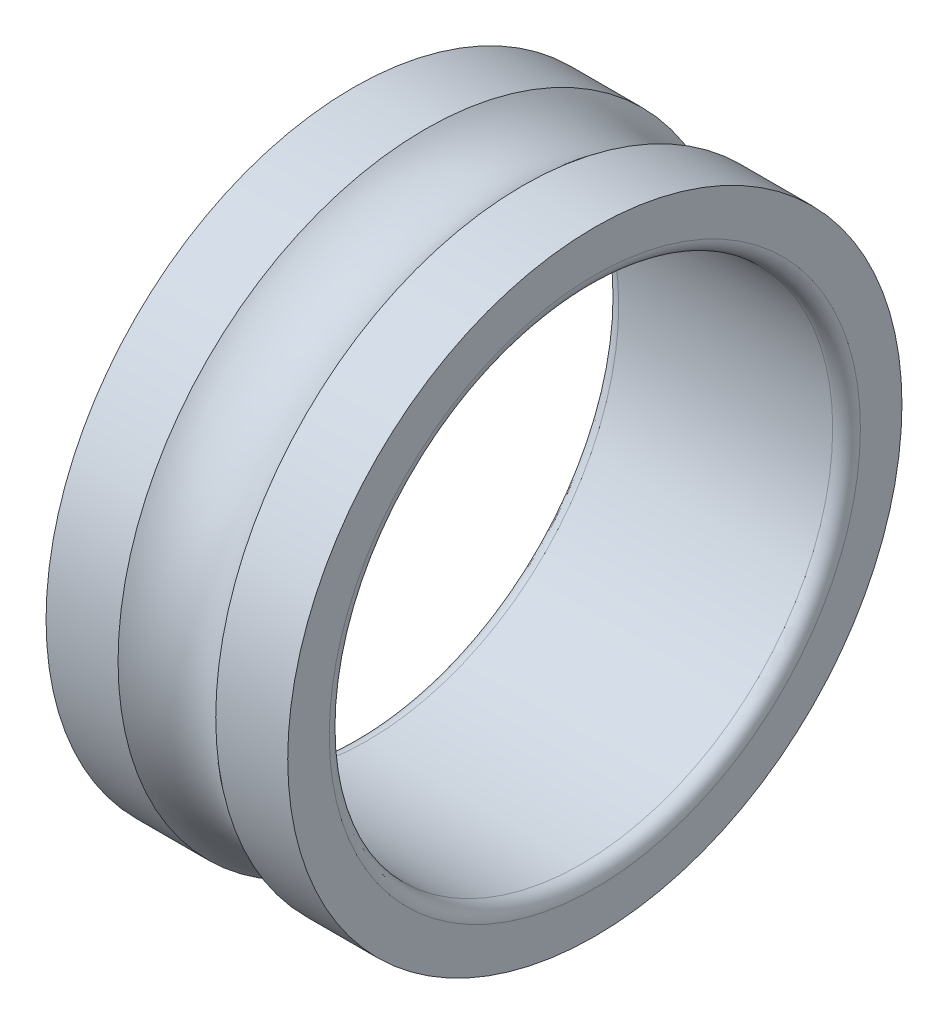
ISO-10303-21;
HEADER;
FILE_DESCRIPTION(('STEP AP214'),'2;1');
FILE_NAME('part.step','',(''),(''),'','','');
FILE_SCHEMA(('AUTOMOTIVE_DESIGN { 1 0 10303 214 1 1 1 1 }'));
ENDSEC;
DATA;
#1=APPLICATION_CONTEXT('core data for automotive mechanical design processes');
#2=APPLICATION_PROTOCOL_DEFINITION('international standard','automotive_design',2000,#1);
#3=PRODUCT_CONTEXT('',#1,'mechanical');
#4=PRODUCT('Part','Part','',(#3));
#5=PRODUCT_RELATED_PRODUCT_CATEGORY('part','',(#4));
#6=PRODUCT_DEFINITION_FORMATION('','',#4);
#7=PRODUCT_DEFINITION_CONTEXT('part definition',#1,'design');
#8=PRODUCT_DEFINITION('design','',#6,#7);
#9=PRODUCT_DEFINITION_SHAPE('','',#8);
#10=(LENGTH_UNIT() NAMED_UNIT(*) SI_UNIT(.MILLI.,.METRE.));
#11=(NAMED_UNIT(*) PLANE_ANGLE_UNIT() SI_UNIT($,.RADIAN.));
#12=(NAMED_UNIT(*) SI_UNIT($,.STERADIAN.) SOLID_ANGLE_UNIT());
#13=UNCERTAINTY_MEASURE_WITH_UNIT(LENGTH_MEASURE(1.E-05),#10,'distance_accuracy_value','');
#14=(GEOMETRIC_REPRESENTATION_CONTEXT(3) GLOBAL_UNCERTAINTY_ASSIGNED_CONTEXT((#13)) GLOBAL_UNIT_ASSIGNED_CONTEXT((#10,
#11,#12)) REPRESENTATION_CONTEXT('',''));
#15=CARTESIAN_POINT('',(0.,0.,0.));
#16=DIRECTION('',(0.,0.,1.));
#17=DIRECTION('',(1.,0.,0.));
#18=AXIS2_PLACEMENT_3D('',#15,#16,#17);
#19=CARTESIAN_POINT('',(0.,0.,0.));
#20=DIRECTION('',(-1.,0.,0.));
#21=DIRECTION('',(0.,0.,1.));
#22=AXIS2_PLACEMENT_3D('',#19,#20,#21);
#23=CYLINDRICAL_SURFACE('',#22,15.25);
#24=CARTESIAN_POINT('',(2.42527203514254,0.,0.));
#25=DIRECTION('',(-1.,0.,0.));
#26=DIRECTION('',(0.,0.,1.));
#27=AXIS2_PLACEMENT_3D('',#24,#25,#26);
#28=CIRCLE('',#27,15.25);
#29=CARTESIAN_POINT('',(2.42527203514254,0.,15.25));
#30=VERTEX_POINT('',#29);
#31=EDGE_CURVE('E61',#30,#30,#28,.T.);
#32=ORIENTED_EDGE('',*,*,#31,.F.);
#33=EDGE_LOOP('',(#32));
#34=FACE_BOUND('',#33,.T.);
#35=CARTESIAN_POINT('',(6.,0.,0.));
#36=DIRECTION('',(-1.,0.,0.));
#37=DIRECTION('',(0.,0.,1.));
#38=AXIS2_PLACEMENT_3D('',#35,#36,#37);
#39=CIRCLE('',#38,15.25);
#40=CARTESIAN_POINT('',(6.,0.,15.25));
#41=VERTEX_POINT('',#40);
#42=EDGE_CURVE('E10',#41,#41,#39,.T.);
#43=ORIENTED_EDGE('',*,*,#42,.T.);
#44=EDGE_LOOP('',(#43));
#45=FACE_BOUND('',#44,.T.);
#46=ADVANCED_FACE('F33',(#34,#45),#23,.T.);
#47=CARTESIAN_POINT('',(6.,13.1875,0.));
#48=DIRECTION('',(-1.,0.,0.));
#49=DIRECTION('',(0.,0.,1.));
#50=AXIS2_PLACEMENT_3D('',#47,#48,#49);
#51=PLANE('',#50);
#52=ORIENTED_EDGE('',*,*,#42,.F.);
#53=EDGE_LOOP('',(#52));
#54=FACE_BOUND('',#53,.T.);
#55=CARTESIAN_POINT('',(6.,0.,0.));
#56=DIRECTION('',(-1.,0.,0.));
#57=DIRECTION('',(0.,0.,1.));
#58=AXIS2_PLACEMENT_3D('',#55,#56,#57);
#59=CIRCLE('',#58,13.1875);
#60=CARTESIAN_POINT('',(6.,0.,13.1875));
#61=VERTEX_POINT('',#60);
#62=EDGE_CURVE('E39',#61,#61,#59,.T.);
#63=ORIENTED_EDGE('',*,*,#62,.T.);
#64=EDGE_LOOP('',(#63));
#65=FACE_BOUND('',#64,.T.);
#66=ADVANCED_FACE('F68',(#54,#65),#51,.F.);
#67=CARTESIAN_POINT('',(5.3125,0.,0.));
#68=DIRECTION('',(-1.,0.,0.));
#69=DIRECTION('',(0.,0.,1.));
#70=AXIS2_PLACEMENT_3D('',#67,#68,#69);
#71=TOROIDAL_SURFACE('',#70,13.1875,0.6875);
#72=ORIENTED_EDGE('',*,*,#62,.F.);
#73=EDGE_LOOP('',(#72));
#74=FACE_BOUND('',#73,.T.);
#75=CARTESIAN_POINT('',(5.3125,0.,0.));
#76=DIRECTION('',(-1.,0.,0.));
#77=DIRECTION('',(0.,0.,1.));
#78=AXIS2_PLACEMENT_3D('',#75,#76,#77);
#79=CIRCLE('',#78,12.5);
#80=CARTESIAN_POINT('',(5.3125,0.,12.5));
#81=VERTEX_POINT('',#80);
#82=EDGE_CURVE('E43',#81,#81,#79,.T.);
#83=ORIENTED_EDGE('',*,*,#82,.T.);
#84=EDGE_LOOP('',(#83));
#85=FACE_BOUND('',#84,.T.);
#86=ADVANCED_FACE('F72',(#74,#85),#71,.T.);
#87=CARTESIAN_POINT('',(0.,0.,0.));
#88=DIRECTION('',(-1.,0.,0.));
#89=DIRECTION('',(0.,0.,1.));
#90=AXIS2_PLACEMENT_3D('',#87,#88,#89);
#91=CYLINDRICAL_SURFACE('',#90,12.5);
#92=ORIENTED_EDGE('',*,*,#82,.F.);
#93=EDGE_LOOP('',(#92));
#94=FACE_BOUND('',#93,.T.);
#95=CARTESIAN_POINT('',(-5.3125,0.,0.));
#96=DIRECTION('',(-1.,0.,0.));
#97=DIRECTION('',(0.,0.,1.));
#98=AXIS2_PLACEMENT_3D('',#95,#96,#97);
#99=CIRCLE('',#98,12.5);
#100=CARTESIAN_POINT('',(-5.3125,0.,12.5));
#101=VERTEX_POINT('',#100);
#102=EDGE_CURVE('E47',#101,#101,#99,.T.);
#103=ORIENTED_EDGE('',*,*,#102,.T.);
#104=EDGE_LOOP('',(#103));
#105=FACE_BOUND('',#104,.T.);
#106=ADVANCED_FACE('F77',(#94,#105),#91,.F.);
#107=CARTESIAN_POINT('',(-5.3125,0.,0.));
#108=DIRECTION('',(-1.,0.,0.));
#109=DIRECTION('',(0.,0.,1.));
#110=AXIS2_PLACEMENT_3D('',#107,#108,#109);
#111=TOROIDAL_SURFACE('',#110,13.1875,0.687500000000001);
#112=ORIENTED_EDGE('',*,*,#102,.F.);
#113=EDGE_LOOP('',(#112));
#114=FACE_BOUND('',#113,.T.);
#115=CARTESIAN_POINT('',(-6.,0.,0.));
#116=DIRECTION('',(-1.,0.,0.));
#117=DIRECTION('',(0.,0.,1.));
#118=AXIS2_PLACEMENT_3D('',#115,#116,#117);
#119=CIRCLE('',#118,13.1875);
#120=CARTESIAN_POINT('',(-6.,0.,13.1875));
#121=VERTEX_POINT('',#120);
#122=EDGE_CURVE('E52',#121,#121,#119,.T.);
#123=ORIENTED_EDGE('',*,*,#122,.T.);
#124=EDGE_LOOP('',(#123));
#125=FACE_BOUND('',#124,.T.);
#126=ADVANCED_FACE('F83',(#114,#125),#111,.T.);
#127=CARTESIAN_POINT('',(-6.,13.1875,0.));
#128=DIRECTION('',(1.,0.,0.));
#129=DIRECTION('',(0.,0.,-1.));
#130=AXIS2_PLACEMENT_3D('',#127,#128,#129);
#131=PLANE('',#130);
#132=ORIENTED_EDGE('',*,*,#122,.F.);
#133=EDGE_LOOP('',(#132));
#134=FACE_BOUND('',#133,.T.);
#135=CARTESIAN_POINT('',(-6.,0.,0.));
#136=DIRECTION('',(-1.,0.,0.));
#137=DIRECTION('',(0.,0.,1.));
#138=AXIS2_PLACEMENT_3D('',#135,#136,#137);
#139=CIRCLE('',#138,15.25);
#140=CARTESIAN_POINT('',(-6.,0.,15.25));
#141=VERTEX_POINT('',#140);
#142=EDGE_CURVE('E55',#141,#141,#139,.T.);
#143=ORIENTED_EDGE('',*,*,#142,.T.);
#144=EDGE_LOOP('',(#143));
#145=FACE_BOUND('',#144,.T.);
#146=ADVANCED_FACE('F87',(#134,#145),#131,.F.);
#147=CARTESIAN_POINT('',(0.,0.,0.));
#148=DIRECTION('',(-1.,0.,0.));
#149=DIRECTION('',(0.,0.,1.));
#150=AXIS2_PLACEMENT_3D('',#147,#148,#149);
#151=CYLINDRICAL_SURFACE('',#150,15.25);
#152=ORIENTED_EDGE('',*,*,#142,.F.);
#153=EDGE_LOOP('',(#152));
#154=FACE_BOUND('',#153,.T.);
#155=CARTESIAN_POINT('',(-2.42527203514254,0.,0.));
#156=DIRECTION('',(-1.,0.,0.));
#157=DIRECTION('',(0.,0.,1.));
#158=AXIS2_PLACEMENT_3D('',#155,#156,#157);
#159=CIRCLE('',#158,15.25);
#160=CARTESIAN_POINT('',(-2.42527203514254,0.,15.25));
#161=VERTEX_POINT('',#160);
#162=EDGE_CURVE('E58',#161,#161,#159,.T.);
#163=ORIENTED_EDGE('',*,*,#162,.T.);
#164=EDGE_LOOP('',(#163));
#165=FACE_BOUND('',#164,.T.);
#166=ADVANCED_FACE('F91',(#154,#165),#151,.T.);
#167=CARTESIAN_POINT('',(0.,0.,0.));
#168=DIRECTION('',(-1.,0.,0.));
#169=DIRECTION('',(0.,0.,1.));
#170=AXIS2_PLACEMENT_3D('',#167,#168,#169);
#171=TOROIDAL_SURFACE('',#170,18.,3.66666666666667);
#172=ORIENTED_EDGE('',*,*,#162,.F.);
#173=EDGE_LOOP('',(#172));
#174=FACE_BOUND('',#173,.T.);
#175=ORIENTED_EDGE('',*,*,#31,.T.);
#176=EDGE_LOOP('',(#175));
#177=FACE_BOUND('',#176,.T.);
#178=ADVANCED_FACE('F65',(#174,#177),#171,.F.);
#179=CLOSED_SHELL('',(#46,#66,#86,#106,#126,#146,#166,#178));
#180=MANIFOLD_SOLID_BREP('B2',#179);
#181=ADVANCED_BREP_SHAPE_REPRESENTATION('',(#18,#180),#14);
#182=SHAPE_DEFINITION_REPRESENTATION(#9,#181);
ENDSEC;
END-ISO-10303-21;
